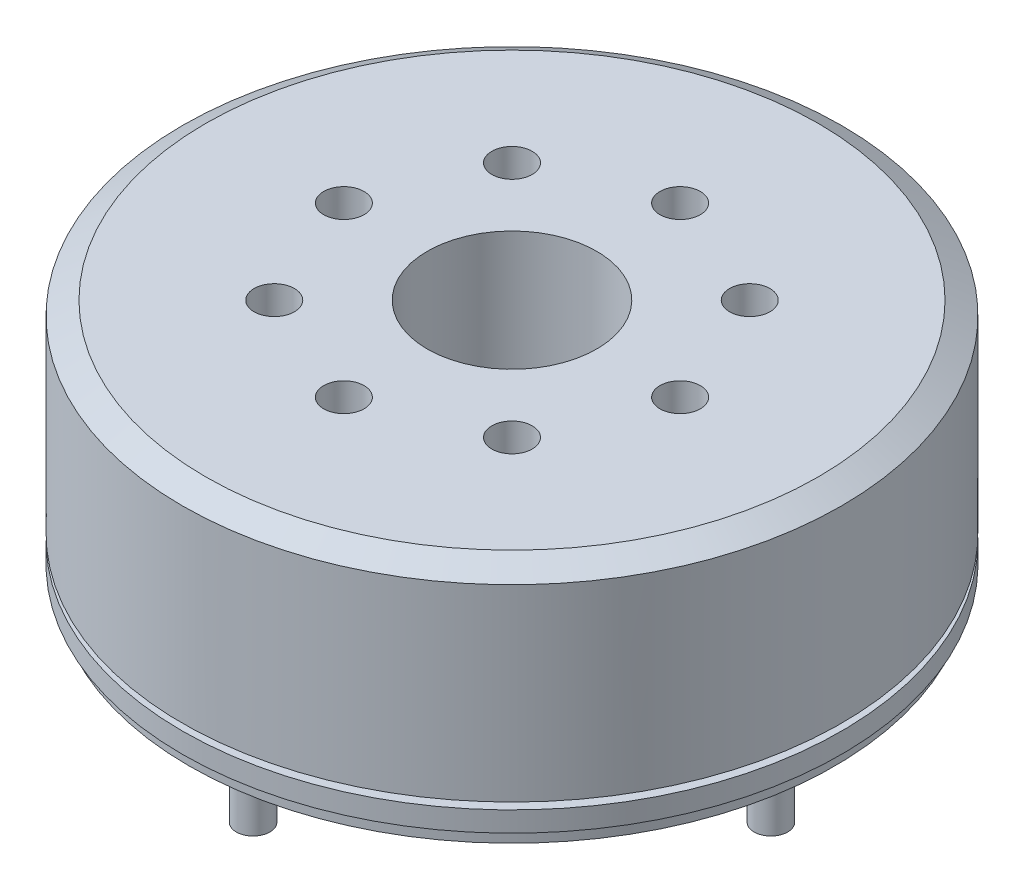
ISO-10303-21;
HEADER;
FILE_DESCRIPTION(('STEP AP214'),'2;1');
FILE_NAME('part.step','',(''),(''),'','','');
FILE_SCHEMA(('AUTOMOTIVE_DESIGN { 1 0 10303 214 1 1 1 1 }'));
ENDSEC;
DATA;
#1=APPLICATION_CONTEXT('core data for automotive mechanical design processes');
#2=APPLICATION_PROTOCOL_DEFINITION('international standard','automotive_design',2000,#1);
#3=PRODUCT_CONTEXT('',#1,'mechanical');
#4=PRODUCT('Part','Part','',(#3));
#5=PRODUCT_RELATED_PRODUCT_CATEGORY('part','',(#4));
#6=PRODUCT_DEFINITION_FORMATION('','',#4);
#7=PRODUCT_DEFINITION_CONTEXT('part definition',#1,'design');
#8=PRODUCT_DEFINITION('design','',#6,#7);
#9=PRODUCT_DEFINITION_SHAPE('','',#8);
#10=(LENGTH_UNIT() NAMED_UNIT(*) SI_UNIT(.MILLI.,.METRE.));
#11=(NAMED_UNIT(*) PLANE_ANGLE_UNIT() SI_UNIT($,.RADIAN.));
#12=(NAMED_UNIT(*) SI_UNIT($,.STERADIAN.) SOLID_ANGLE_UNIT());
#13=UNCERTAINTY_MEASURE_WITH_UNIT(LENGTH_MEASURE(1.E-05),#10,'distance_accuracy_value','');
#14=(GEOMETRIC_REPRESENTATION_CONTEXT(3) GLOBAL_UNCERTAINTY_ASSIGNED_CONTEXT((#13)) GLOBAL_UNIT_ASSIGNED_CONTEXT((#10,
#11,#12)) REPRESENTATION_CONTEXT('',''));
#15=CARTESIAN_POINT('',(0.,0.,0.));
#16=DIRECTION('',(0.,0.,1.));
#17=DIRECTION('',(1.,0.,0.));
#18=AXIS2_PLACEMENT_3D('',#15,#16,#17);
#19=CARTESIAN_POINT('',(0.,17.,0.));
#20=DIRECTION('',(0.,-1.,0.));
#21=DIRECTION('',(0.,0.,-1.));
#22=AXIS2_PLACEMENT_3D('',#19,#20,#21);
#23=CYLINDRICAL_SURFACE('',#22,24.5);
#24=CARTESIAN_POINT('',(0.,16.,0.));
#25=DIRECTION('',(0.,1.,0.));
#26=DIRECTION('',(0.,0.,1.));
#27=AXIS2_PLACEMENT_3D('',#24,#25,#26);
#28=CIRCLE('',#27,24.5);
#29=CARTESIAN_POINT('',(0.,16.,24.5));
#30=VERTEX_POINT('',#29);
#31=EDGE_CURVE('E40',#30,#30,#28,.F.);
#32=ORIENTED_EDGE('',*,*,#31,.T.);
#33=EDGE_LOOP('',(#32));
#34=FACE_BOUND('',#33,.T.);
#35=CARTESIAN_POINT('',(0.,2.00398798470401,0.));
#36=DIRECTION('',(0.,-1.,0.));
#37=DIRECTION('',(0.,0.,-1.));
#38=AXIS2_PLACEMENT_3D('',#35,#36,#37);
#39=CIRCLE('',#38,24.5);
#40=CARTESIAN_POINT('',(0.,2.00398798470401,-24.5));
#41=VERTEX_POINT('',#40);
#42=EDGE_CURVE('E68',#41,#41,#39,.T.);
#43=ORIENTED_EDGE('',*,*,#42,.F.);
#44=EDGE_LOOP('',(#43));
#45=FACE_BOUND('',#44,.T.);
#46=ADVANCED_FACE('F35',(#34,#45),#23,.T.);
#47=CARTESIAN_POINT('',(0.,17.,0.));
#48=DIRECTION('',(0.,1.,0.));
#49=DIRECTION('',(0.,0.,1.));
#50=AXIS2_PLACEMENT_3D('',#47,#48,#49);
#51=PLANE('',#50);
#52=CARTESIAN_POINT('',(-12.5,17.,0.));
#53=DIRECTION('',(0.,1.,0.));
#54=DIRECTION('',(1.,0.,0.));
#55=AXIS2_PLACEMENT_3D('',#52,#53,#54);
#56=CIRCLE('',#55,1.5);
#57=CARTESIAN_POINT('',(-11.,17.,0.));
#58=VERTEX_POINT('',#57);
#59=EDGE_CURVE('E399',#58,#58,#56,.T.);
#60=ORIENTED_EDGE('',*,*,#59,.F.);
#61=EDGE_LOOP('',(#60));
#62=FACE_BOUND('',#61,.T.);
#63=CARTESIAN_POINT('',(-8.8388347648318,17.,8.83883476483189));
#64=DIRECTION('',(0.,1.,0.));
#65=DIRECTION('',(0.707106781186544,0.,-0.707106781186551));
#66=AXIS2_PLACEMENT_3D('',#63,#64,#65);
#67=CIRCLE('',#66,1.5);
#68=CARTESIAN_POINT('',(-7.77817459305198,17.,7.77817459305206));
#69=VERTEX_POINT('',#68);
#70=EDGE_CURVE('E405',#69,#69,#67,.T.);
#71=ORIENTED_EDGE('',*,*,#70,.F.);
#72=EDGE_LOOP('',(#71));
#73=FACE_BOUND('',#72,.T.);
#74=CARTESIAN_POINT('',(0.,17.,12.5));
#75=DIRECTION('',(0.,1.,0.));
#76=DIRECTION('',(0.,0.,-1.));
#77=AXIS2_PLACEMENT_3D('',#74,#75,#76);
#78=CIRCLE('',#77,1.5);
#79=CARTESIAN_POINT('',(0.,17.,11.));
#80=VERTEX_POINT('',#79);
#81=EDGE_CURVE('E411',#80,#80,#78,.T.);
#82=ORIENTED_EDGE('',*,*,#81,.F.);
#83=EDGE_LOOP('',(#82));
#84=FACE_BOUND('',#83,.T.);
#85=CARTESIAN_POINT('',(8.83883476483192,17.,8.83883476483177));
#86=DIRECTION('',(0.,1.,0.));
#87=DIRECTION('',(-0.707106781186554,0.,-0.707106781186541));
#88=AXIS2_PLACEMENT_3D('',#85,#86,#87);
#89=CIRCLE('',#88,1.5);
#90=CARTESIAN_POINT('',(7.77817459305209,17.,7.77817459305196));
#91=VERTEX_POINT('',#90);
#92=EDGE_CURVE('E386',#91,#91,#89,.T.);
#93=ORIENTED_EDGE('',*,*,#92,.F.);
#94=EDGE_LOOP('',(#93));
#95=FACE_BOUND('',#94,.T.);
#96=CARTESIAN_POINT('',(12.5,17.,-1.30930550206618E-13));
#97=DIRECTION('',(0.,1.,0.));
#98=DIRECTION('',(-1.,0.,0.));
#99=AXIS2_PLACEMENT_3D('',#96,#97,#98);
#100=CIRCLE('',#99,1.5);
#101=CARTESIAN_POINT('',(11.,17.,-1.15218884181823E-13));
#102=VERTEX_POINT('',#101);
#103=EDGE_CURVE('E387',#102,#102,#100,.T.);
#104=ORIENTED_EDGE('',*,*,#103,.F.);
#105=EDGE_LOOP('',(#104));
#106=FACE_BOUND('',#105,.T.);
#107=CARTESIAN_POINT('',(8.83883476483174,17.,-8.83883476483195));
#108=DIRECTION('',(0.,1.,0.));
#109=DIRECTION('',(-0.707106781186539,0.,0.707106781186556));
#110=AXIS2_PLACEMENT_3D('',#107,#108,#109);
#111=CIRCLE('',#110,1.5);
#112=CARTESIAN_POINT('',(7.77817459305193,17.,-7.77817459305212));
#113=VERTEX_POINT('',#112);
#114=EDGE_CURVE('E380',#113,#113,#111,.T.);
#115=ORIENTED_EDGE('',*,*,#114,.F.);
#116=EDGE_LOOP('',(#115));
#117=FACE_BOUND('',#116,.T.);
#118=CARTESIAN_POINT('',(-8.83883476483186,17.,-8.83883476483183));
#119=DIRECTION('',(0.,1.,0.));
#120=DIRECTION('',(0.707106781186549,0.,0.707106781186546));
#121=AXIS2_PLACEMENT_3D('',#118,#119,#120);
#122=CIRCLE('',#121,1.5);
#123=CARTESIAN_POINT('',(-7.77817459305204,17.,-7.77817459305201));
#124=VERTEX_POINT('',#123);
#125=EDGE_CURVE('E398',#124,#124,#122,.T.);
#126=ORIENTED_EDGE('',*,*,#125,.F.);
#127=EDGE_LOOP('',(#126));
#128=FACE_BOUND('',#127,.T.);
#129=CARTESIAN_POINT('',(0.,17.,-12.5));
#130=DIRECTION('',(0.,1.,0.));
#131=DIRECTION('',(0.,0.,1.));
#132=AXIS2_PLACEMENT_3D('',#129,#130,#131);
#133=CIRCLE('',#132,1.5);
#134=CARTESIAN_POINT('',(0.,17.,-11.));
#135=VERTEX_POINT('',#134);
#136=EDGE_CURVE('E422',#135,#135,#133,.T.);
#137=ORIENTED_EDGE('',*,*,#136,.F.);
#138=EDGE_LOOP('',(#137));
#139=FACE_BOUND('',#138,.T.);
#140=CARTESIAN_POINT('',(0.,17.,0.));
#141=DIRECTION('',(0.,1.,0.));
#142=DIRECTION('',(0.,0.,1.));
#143=AXIS2_PLACEMENT_3D('',#140,#141,#142);
#144=CIRCLE('',#143,6.3);
#145=CARTESIAN_POINT('',(0.,17.,6.3));
#146=VERTEX_POINT('',#145);
#147=EDGE_CURVE('E440',#146,#146,#144,.T.);
#148=ORIENTED_EDGE('',*,*,#147,.F.);
#149=EDGE_LOOP('',(#148));
#150=FACE_BOUND('',#149,.T.);
#151=CARTESIAN_POINT('',(0.,17.,0.));
#152=DIRECTION('',(0.,1.,0.));
#153=DIRECTION('',(0.,0.,1.));
#154=AXIS2_PLACEMENT_3D('',#151,#152,#153);
#155=CIRCLE('',#154,22.7679491924311);
#156=CARTESIAN_POINT('',(0.,17.,22.7679491924311));
#157=VERTEX_POINT('',#156);
#158=EDGE_CURVE('E67',#157,#157,#155,.T.);
#159=ORIENTED_EDGE('',*,*,#158,.T.);
#160=EDGE_LOOP('',(#159));
#161=FACE_BOUND('',#160,.T.);
#162=ADVANCED_FACE('F94',(#62,#73,#84,#95,#106,#117,#128,#139,#150,#161),#51,.T.);
#163=CARTESIAN_POINT('',(0.,2.00398798470401,23.5));
#164=DIRECTION('',(0.,-1.,0.));
#165=DIRECTION('',(0.,0.,-1.));
#166=AXIS2_PLACEMENT_3D('',#163,#164,#165);
#167=PLANE('',#166);
#168=CARTESIAN_POINT('',(0.,2.00398798470401,0.));
#169=DIRECTION('',(0.,-1.,0.));
#170=DIRECTION('',(0.,0.,-1.));
#171=AXIS2_PLACEMENT_3D('',#168,#169,#170);
#172=CIRCLE('',#171,23.5);
#173=CARTESIAN_POINT('',(0.,2.00398798470401,-23.5));
#174=VERTEX_POINT('',#173);
#175=EDGE_CURVE('E56',#174,#174,#172,.T.);
#176=ORIENTED_EDGE('',*,*,#175,.F.);
#177=EDGE_LOOP('',(#176));
#178=FACE_BOUND('',#177,.T.);
#179=ORIENTED_EDGE('',*,*,#42,.T.);
#180=EDGE_LOOP('',(#179));
#181=FACE_BOUND('',#180,.T.);
#182=ADVANCED_FACE('F98',(#178,#181),#167,.T.);
#183=CARTESIAN_POINT('',(0.,1.5,25.8374556553472));
#184=DIRECTION('',(0.,1.,0.));
#185=DIRECTION('',(0.,0.,1.));
#186=AXIS2_PLACEMENT_3D('',#183,#184,#185);
#187=PLANE('',#186);
#188=CARTESIAN_POINT('',(0.,1.5,0.));
#189=DIRECTION('',(0.,-1.,0.));
#190=DIRECTION('',(0.,0.,-1.));
#191=AXIS2_PLACEMENT_3D('',#188,#189,#190);
#192=CIRCLE('',#191,23.5);
#193=CARTESIAN_POINT('',(0.,1.5,-23.5));
#194=VERTEX_POINT('',#193);
#195=EDGE_CURVE('E60',#194,#194,#192,.T.);
#196=ORIENTED_EDGE('',*,*,#195,.T.);
#197=EDGE_LOOP('',(#196));
#198=FACE_BOUND('',#197,.T.);
#199=CARTESIAN_POINT('',(0.,1.5,0.));
#200=DIRECTION('',(0.,1.,0.));
#201=DIRECTION('',(0.,0.,1.));
#202=AXIS2_PLACEMENT_3D('',#199,#200,#201);
#203=CIRCLE('',#202,24.5);
#204=CARTESIAN_POINT('',(0.,1.5,24.5));
#205=VERTEX_POINT('',#204);
#206=EDGE_CURVE('E63',#205,#205,#203,.T.);
#207=ORIENTED_EDGE('',*,*,#206,.T.);
#208=EDGE_LOOP('',(#207));
#209=FACE_BOUND('',#208,.T.);
#210=ADVANCED_FACE('F108',(#198,#209),#187,.T.);
#211=CARTESIAN_POINT('',(0.,0.,0.));
#212=DIRECTION('',(0.,-1.,0.));
#213=DIRECTION('',(0.,0.,-1.));
#214=AXIS2_PLACEMENT_3D('',#211,#212,#213);
#215=CYLINDRICAL_SURFACE('',#214,23.5);
#216=ORIENTED_EDGE('',*,*,#175,.T.);
#217=EDGE_LOOP('',(#216));
#218=FACE_BOUND('',#217,.T.);
#219=ORIENTED_EDGE('',*,*,#195,.F.);
#220=EDGE_LOOP('',(#219));
#221=FACE_BOUND('',#220,.T.);
#222=ADVANCED_FACE('F103',(#218,#221),#215,.T.);
#223=CARTESIAN_POINT('',(0.,0.,0.));
#224=DIRECTION('',(0.,1.,0.));
#225=DIRECTION('',(0.,0.,1.));
#226=AXIS2_PLACEMENT_3D('',#223,#224,#225);
#227=PLANE('',#226);
#228=CARTESIAN_POINT('',(0.,0.,0.));
#229=DIRECTION('',(0.,-1.,0.));
#230=DIRECTION('',(0.,0.,-1.));
#231=AXIS2_PLACEMENT_3D('',#228,#229,#230);
#232=CIRCLE('',#231,24.);
#233=CARTESIAN_POINT('',(0.,0.,-24.));
#234=VERTEX_POINT('',#233);
#235=EDGE_CURVE('E44',#234,#234,#232,.T.);
#236=ORIENTED_EDGE('',*,*,#235,.F.);
#237=EDGE_LOOP('',(#236));
#238=FACE_BOUND('',#237,.T.);
#239=CARTESIAN_POINT('',(0.,0.,0.));
#240=DIRECTION('',(0.,1.,0.));
#241=DIRECTION('',(0.,0.,1.));
#242=AXIS2_PLACEMENT_3D('',#239,#240,#241);
#243=CIRCLE('',#242,24.5);
#244=CARTESIAN_POINT('',(0.,0.,24.5));
#245=VERTEX_POINT('',#244);
#246=EDGE_CURVE('E64',#245,#245,#243,.T.);
#247=ORIENTED_EDGE('',*,*,#246,.F.);
#248=EDGE_LOOP('',(#247));
#249=FACE_BOUND('',#248,.T.);
#250=ADVANCED_FACE('F91',(#238,#249),#227,.F.);
#251=ORIENTED_EDGE('',*,*,#246,.T.);
#252=EDGE_LOOP('',(#251));
#253=FACE_BOUND('',#252,.T.);
#254=ORIENTED_EDGE('',*,*,#206,.F.);
#255=EDGE_LOOP('',(#254));
#256=FACE_BOUND('',#255,.T.);
#257=ADVANCED_FACE('F83',(#253,#256),#23,.T.);
#258=CARTESIAN_POINT('',(0.,17.,0.));
#259=DIRECTION('',(0.,-1.,0.));
#260=DIRECTION('',(0.,0.,-1.));
#261=AXIS2_PLACEMENT_3D('',#258,#259,#260);
#262=CONICAL_SURFACE('',#261,22.7679491924311,1.04719755119659);
#263=ORIENTED_EDGE('',*,*,#31,.F.);
#264=EDGE_LOOP('',(#263));
#265=FACE_BOUND('',#264,.T.);
#266=ORIENTED_EDGE('',*,*,#158,.F.);
#267=EDGE_LOOP('',(#266));
#268=FACE_BOUND('',#267,.T.);
#269=ADVANCED_FACE('F38',(#265,#268),#262,.T.);
#270=CARTESIAN_POINT('',(0.,-1.,0.));
#271=DIRECTION('',(0.,1.,0.));
#272=DIRECTION('',(0.,0.,1.));
#273=AXIS2_PLACEMENT_3D('',#270,#271,#272);
#274=CYLINDRICAL_SURFACE('',#273,24.);
#275=CARTESIAN_POINT('',(0.,-1.,0.));
#276=DIRECTION('',(0.,-1.,0.));
#277=DIRECTION('',(0.,0.,-1.));
#278=AXIS2_PLACEMENT_3D('',#275,#276,#277);
#279=CIRCLE('',#278,24.);
#280=CARTESIAN_POINT('',(0.,-1.,-24.));
#281=VERTEX_POINT('',#280);
#282=EDGE_CURVE('E54',#281,#281,#279,.T.);
#283=ORIENTED_EDGE('',*,*,#282,.F.);
#284=EDGE_LOOP('',(#283));
#285=FACE_BOUND('',#284,.T.);
#286=ORIENTED_EDGE('',*,*,#235,.T.);
#287=EDGE_LOOP('',(#286));
#288=FACE_BOUND('',#287,.T.);
#289=ADVANCED_FACE('F82',(#285,#288),#274,.T.);
#290=CARTESIAN_POINT('',(0.,-1.,0.));
#291=DIRECTION('',(0.,-1.,0.));
#292=DIRECTION('',(0.,0.,-1.));
#293=AXIS2_PLACEMENT_3D('',#290,#291,#292);
#294=PLANE('',#293);
#295=CARTESIAN_POINT('',(19.25,-1.,2.01633047318191E-13));
#296=DIRECTION('',(0.,-1.,0.));
#297=DIRECTION('',(-1.,0.,0.));
#298=AXIS2_PLACEMENT_3D('',#295,#296,#297);
#299=CIRCLE('',#298,1.25);
#300=CARTESIAN_POINT('',(18.,-1.,1.88539992297529E-13));
#301=VERTEX_POINT('',#300);
#302=EDGE_CURVE('E312',#301,#301,#299,.T.);
#303=ORIENTED_EDGE('',*,*,#302,.F.);
#304=EDGE_LOOP('',(#303));
#305=FACE_BOUND('',#304,.T.);
#306=CARTESIAN_POINT('',(0.,-1.,-19.25));
#307=DIRECTION('',(0.,-1.,0.));
#308=DIRECTION('',(0.,0.,1.));
#309=AXIS2_PLACEMENT_3D('',#306,#307,#308);
#310=CIRCLE('',#309,1.25);
#311=CARTESIAN_POINT('',(0.,-1.,-18.));
#312=VERTEX_POINT('',#311);
#313=EDGE_CURVE('E311',#312,#312,#310,.T.);
#314=ORIENTED_EDGE('',*,*,#313,.F.);
#315=EDGE_LOOP('',(#314));
#316=FACE_BOUND('',#315,.T.);
#317=CARTESIAN_POINT('',(-19.25,-1.,0.));
#318=DIRECTION('',(0.,-1.,0.));
#319=DIRECTION('',(1.,0.,0.));
#320=AXIS2_PLACEMENT_3D('',#317,#318,#319);
#321=CIRCLE('',#320,1.25);
#322=CARTESIAN_POINT('',(-18.,-1.,0.));
#323=VERTEX_POINT('',#322);
#324=EDGE_CURVE('E321',#323,#323,#321,.T.);
#325=ORIENTED_EDGE('',*,*,#324,.F.);
#326=EDGE_LOOP('',(#325));
#327=FACE_BOUND('',#326,.T.);
#328=CARTESIAN_POINT('',(0.,-1.,19.25));
#329=DIRECTION('',(0.,-1.,0.));
#330=DIRECTION('',(0.,0.,-1.));
#331=AXIS2_PLACEMENT_3D('',#328,#329,#330);
#332=CIRCLE('',#331,1.25);
#333=CARTESIAN_POINT('',(0.,-1.,18.));
#334=VERTEX_POINT('',#333);
#335=EDGE_CURVE('E326',#334,#334,#332,.T.);
#336=ORIENTED_EDGE('',*,*,#335,.F.);
#337=EDGE_LOOP('',(#336));
#338=FACE_BOUND('',#337,.T.);
#339=CARTESIAN_POINT('',(-15.,-1.,0.));
#340=DIRECTION('',(0.,-1.,0.));
#341=DIRECTION('',(1.,0.,0.));
#342=AXIS2_PLACEMENT_3D('',#339,#340,#341);
#343=CIRCLE('',#342,1.5);
#344=CARTESIAN_POINT('',(-13.5,-1.,0.));
#345=VERTEX_POINT('',#344);
#346=EDGE_CURVE('E363',#345,#345,#343,.T.);
#347=ORIENTED_EDGE('',*,*,#346,.F.);
#348=EDGE_LOOP('',(#347));
#349=FACE_BOUND('',#348,.T.);
#350=CARTESIAN_POINT('',(0.,-1.,-15.));
#351=DIRECTION('',(0.,-1.,0.));
#352=DIRECTION('',(0.,0.,1.));
#353=AXIS2_PLACEMENT_3D('',#350,#351,#352);
#354=CIRCLE('',#353,1.5);
#355=CARTESIAN_POINT('',(0.,-1.,-13.5));
#356=VERTEX_POINT('',#355);
#357=EDGE_CURVE('E369',#356,#356,#354,.T.);
#358=ORIENTED_EDGE('',*,*,#357,.F.);
#359=EDGE_LOOP('',(#358));
#360=FACE_BOUND('',#359,.T.);
#361=CARTESIAN_POINT('',(15.,-1.,1.57116660247941E-13));
#362=DIRECTION('',(0.,-1.,0.));
#363=DIRECTION('',(-1.,0.,0.));
#364=AXIS2_PLACEMENT_3D('',#361,#362,#363);
#365=CIRCLE('',#364,1.5);
#366=CARTESIAN_POINT('',(13.5,-1.,1.41404994223147E-13));
#367=VERTEX_POINT('',#366);
#368=EDGE_CURVE('E356',#367,#367,#365,.T.);
#369=ORIENTED_EDGE('',*,*,#368,.F.);
#370=EDGE_LOOP('',(#369));
#371=FACE_BOUND('',#370,.T.);
#372=CARTESIAN_POINT('',(0.,-1.,15.));
#373=DIRECTION('',(0.,-1.,0.));
#374=DIRECTION('',(0.,0.,-1.));
#375=AXIS2_PLACEMENT_3D('',#372,#373,#374);
#376=CIRCLE('',#375,1.5);
#377=CARTESIAN_POINT('',(0.,-1.,13.5));
#378=VERTEX_POINT('',#377);
#379=EDGE_CURVE('E362',#378,#378,#376,.T.);
#380=ORIENTED_EDGE('',*,*,#379,.F.);
#381=EDGE_LOOP('',(#380));
#382=FACE_BOUND('',#381,.T.);
#383=CARTESIAN_POINT('',(0.,-1.,0.));
#384=DIRECTION('',(0.,-1.,0.));
#385=DIRECTION('',(0.,0.,-1.));
#386=AXIS2_PLACEMENT_3D('',#383,#384,#385);
#387=CIRCLE('',#386,8.3);
#388=CARTESIAN_POINT('',(0.,-1.,-8.3));
#389=VERTEX_POINT('',#388);
#390=EDGE_CURVE('E10',#389,#389,#387,.T.);
#391=ORIENTED_EDGE('',*,*,#390,.F.);
#392=EDGE_LOOP('',(#391));
#393=FACE_BOUND('',#392,.T.);
#394=ORIENTED_EDGE('',*,*,#282,.T.);
#395=EDGE_LOOP('',(#394));
#396=FACE_BOUND('',#395,.T.);
#397=ADVANCED_FACE('F88',(#305,#316,#327,#338,#349,#360,#371,#382,#393,#396),#294,.T.);
#398=CARTESIAN_POINT('',(0.,-2.,0.));
#399=DIRECTION('',(0.,1.,0.));
#400=DIRECTION('',(0.,0.,1.));
#401=AXIS2_PLACEMENT_3D('',#398,#399,#400);
#402=CYLINDRICAL_SURFACE('',#401,8.3);
#403=CARTESIAN_POINT('',(0.,-2.,0.));
#404=DIRECTION('',(0.,-1.,0.));
#405=DIRECTION('',(0.,0.,-1.));
#406=AXIS2_PLACEMENT_3D('',#403,#404,#405);
#407=CIRCLE('',#406,8.3);
#408=CARTESIAN_POINT('',(0.,-2.,-8.3));
#409=VERTEX_POINT('',#408);
#410=EDGE_CURVE('E52',#409,#409,#407,.T.);
#411=ORIENTED_EDGE('',*,*,#410,.F.);
#412=EDGE_LOOP('',(#411));
#413=FACE_BOUND('',#412,.T.);
#414=ORIENTED_EDGE('',*,*,#390,.T.);
#415=EDGE_LOOP('',(#414));
#416=FACE_BOUND('',#415,.T.);
#417=ADVANCED_FACE('F118',(#413,#416),#402,.T.);
#418=CARTESIAN_POINT('',(0.,-2.,0.));
#419=DIRECTION('',(0.,-1.,0.));
#420=DIRECTION('',(0.,0.,-1.));
#421=AXIS2_PLACEMENT_3D('',#418,#419,#420);
#422=PLANE('',#421);
#423=CARTESIAN_POINT('',(5.1724854039699,-2.,0.));
#424=DIRECTION('',(0.,-1.,0.));
#425=DIRECTION('',(-1.,0.,0.));
#426=AXIS2_PLACEMENT_3D('',#423,#424,#425);
#427=CIRCLE('',#426,1.25);
#428=CARTESIAN_POINT('',(3.9224854039699,-2.,0.));
#429=VERTEX_POINT('',#428);
#430=EDGE_CURVE('E339',#429,#429,#427,.T.);
#431=ORIENTED_EDGE('',*,*,#430,.F.);
#432=EDGE_LOOP('',(#431));
#433=FACE_BOUND('',#432,.T.);
#434=CARTESIAN_POINT('',(0.,-2.,-5.1724854039699));
#435=DIRECTION('',(0.,-1.,0.));
#436=DIRECTION('',(0.,0.,1.));
#437=AXIS2_PLACEMENT_3D('',#434,#435,#436);
#438=CIRCLE('',#437,1.25);
#439=CARTESIAN_POINT('',(0.,-2.,-3.9224854039699));
#440=VERTEX_POINT('',#439);
#441=EDGE_CURVE('E345',#440,#440,#438,.T.);
#442=ORIENTED_EDGE('',*,*,#441,.F.);
#443=EDGE_LOOP('',(#442));
#444=FACE_BOUND('',#443,.T.);
#445=CARTESIAN_POINT('',(-5.1724854039699,-2.,0.));
#446=DIRECTION('',(0.,-1.,0.));
#447=DIRECTION('',(1.,0.,0.));
#448=AXIS2_PLACEMENT_3D('',#445,#446,#447);
#449=CIRCLE('',#448,1.25);
#450=CARTESIAN_POINT('',(-3.9224854039699,-2.,0.));
#451=VERTEX_POINT('',#450);
#452=EDGE_CURVE('E332',#451,#451,#449,.T.);
#453=ORIENTED_EDGE('',*,*,#452,.F.);
#454=EDGE_LOOP('',(#453));
#455=FACE_BOUND('',#454,.T.);
#456=CARTESIAN_POINT('',(0.,-2.,5.1724854039699));
#457=DIRECTION('',(0.,-1.,0.));
#458=DIRECTION('',(0.,0.,-1.));
#459=AXIS2_PLACEMENT_3D('',#456,#457,#458);
#460=CIRCLE('',#459,1.25);
#461=CARTESIAN_POINT('',(0.,-2.,3.9224854039699));
#462=VERTEX_POINT('',#461);
#463=EDGE_CURVE('E338',#462,#462,#460,.T.);
#464=ORIENTED_EDGE('',*,*,#463,.F.);
#465=EDGE_LOOP('',(#464));
#466=FACE_BOUND('',#465,.T.);
#467=CARTESIAN_POINT('',(0.,-2.,0.));
#468=DIRECTION('',(0.,-1.,0.));
#469=DIRECTION('',(0.,0.,-1.));
#470=AXIS2_PLACEMENT_3D('',#467,#468,#469);
#471=CIRCLE('',#470,2.5);
#472=CARTESIAN_POINT('',(0.,-2.,-2.5));
#473=VERTEX_POINT('',#472);
#474=EDGE_CURVE('E433',#473,#473,#471,.F.);
#475=ORIENTED_EDGE('',*,*,#474,.T.);
#476=EDGE_LOOP('',(#475));
#477=FACE_BOUND('',#476,.T.);
#478=ORIENTED_EDGE('',*,*,#410,.T.);
#479=EDGE_LOOP('',(#478));
#480=FACE_BOUND('',#479,.T.);
#481=ADVANCED_FACE('F122',(#433,#444,#455,#466,#477,#480),#422,.T.);
#482=CARTESIAN_POINT('',(0.,3.,0.));
#483=DIRECTION('',(0.,1.,0.));
#484=DIRECTION('',(0.,0.,1.));
#485=AXIS2_PLACEMENT_3D('',#482,#483,#484);
#486=CYLINDRICAL_SURFACE('',#485,6.3);
#487=CARTESIAN_POINT('',(0.,3.,0.));
#488=DIRECTION('',(0.,1.,0.));
#489=DIRECTION('',(0.,0.,1.));
#490=AXIS2_PLACEMENT_3D('',#487,#488,#489);
#491=CIRCLE('',#490,6.3);
#492=CARTESIAN_POINT('',(0.,3.,6.3));
#493=VERTEX_POINT('',#492);
#494=EDGE_CURVE('E443',#493,#493,#491,.T.);
#495=ORIENTED_EDGE('',*,*,#494,.F.);
#496=EDGE_LOOP('',(#495));
#497=FACE_BOUND('',#496,.T.);
#498=ORIENTED_EDGE('',*,*,#147,.T.);
#499=EDGE_LOOP('',(#498));
#500=FACE_BOUND('',#499,.T.);
#501=ADVANCED_FACE('F126',(#497,#500),#486,.F.);
#502=CARTESIAN_POINT('',(0.,3.,0.));
#503=DIRECTION('',(0.,1.,0.));
#504=DIRECTION('',(0.,0.,1.));
#505=AXIS2_PLACEMENT_3D('',#502,#503,#504);
#506=PLANE('',#505);
#507=CARTESIAN_POINT('',(0.,3.,0.));
#508=DIRECTION('',(0.,1.,0.));
#509=DIRECTION('',(0.,0.,1.));
#510=AXIS2_PLACEMENT_3D('',#507,#508,#509);
#511=CIRCLE('',#510,4.);
#512=CARTESIAN_POINT('',(0.,3.,4.));
#513=VERTEX_POINT('',#512);
#514=EDGE_CURVE('E436',#513,#513,#511,.T.);
#515=ORIENTED_EDGE('',*,*,#514,.F.);
#516=EDGE_LOOP('',(#515));
#517=FACE_BOUND('',#516,.T.);
#518=ORIENTED_EDGE('',*,*,#494,.T.);
#519=EDGE_LOOP('',(#518));
#520=FACE_BOUND('',#519,.T.);
#521=ADVANCED_FACE('F130',(#517,#520),#506,.T.);
#522=CARTESIAN_POINT('',(0.,0.,0.));
#523=DIRECTION('',(0.,1.,0.));
#524=DIRECTION('',(0.,0.,1.));
#525=AXIS2_PLACEMENT_3D('',#522,#523,#524);
#526=CYLINDRICAL_SURFACE('',#525,4.);
#527=CARTESIAN_POINT('',(0.,0.,0.));
#528=DIRECTION('',(0.,1.,0.));
#529=DIRECTION('',(0.,0.,1.));
#530=AXIS2_PLACEMENT_3D('',#527,#528,#529);
#531=CIRCLE('',#530,4.);
#532=CARTESIAN_POINT('',(0.,0.,4.));
#533=VERTEX_POINT('',#532);
#534=EDGE_CURVE('E437',#533,#533,#531,.T.);
#535=ORIENTED_EDGE('',*,*,#534,.F.);
#536=EDGE_LOOP('',(#535));
#537=FACE_BOUND('',#536,.T.);
#538=ORIENTED_EDGE('',*,*,#514,.T.);
#539=EDGE_LOOP('',(#538));
#540=FACE_BOUND('',#539,.T.);
#541=ADVANCED_FACE('F134',(#537,#540),#526,.F.);
#542=CARTESIAN_POINT('',(0.,0.,0.));
#543=DIRECTION('',(0.,1.,0.));
#544=DIRECTION('',(0.,0.,1.));
#545=AXIS2_PLACEMENT_3D('',#542,#543,#544);
#546=PLANE('',#545);
#547=CARTESIAN_POINT('',(0.,0.,0.));
#548=DIRECTION('',(0.,1.,0.));
#549=DIRECTION('',(0.,0.,1.));
#550=AXIS2_PLACEMENT_3D('',#547,#548,#549);
#551=CIRCLE('',#550,2.5);
#552=CARTESIAN_POINT('',(0.,0.,2.5));
#553=VERTEX_POINT('',#552);
#554=EDGE_CURVE('E428',#553,#553,#551,.T.);
#555=ORIENTED_EDGE('',*,*,#554,.F.);
#556=EDGE_LOOP('',(#555));
#557=FACE_BOUND('',#556,.T.);
#558=ORIENTED_EDGE('',*,*,#534,.T.);
#559=EDGE_LOOP('',(#558));
#560=FACE_BOUND('',#559,.T.);
#561=ADVANCED_FACE('F138',(#557,#560),#546,.T.);
#562=CARTESIAN_POINT('',(0.,-9.07106781186547,0.));
#563=DIRECTION('',(0.,1.,0.));
#564=DIRECTION('',(0.,0.,1.));
#565=AXIS2_PLACEMENT_3D('',#562,#563,#564);
#566=CYLINDRICAL_SURFACE('',#565,2.5);
#567=ORIENTED_EDGE('',*,*,#554,.T.);
#568=EDGE_LOOP('',(#567));
#569=FACE_BOUND('',#568,.T.);
#570=ORIENTED_EDGE('',*,*,#474,.F.);
#571=EDGE_LOOP('',(#570));
#572=FACE_BOUND('',#571,.T.);
#573=ADVANCED_FACE('F142',(#569,#572),#566,.F.);
#574=CARTESIAN_POINT('',(0.,14.,-12.5));
#575=DIRECTION('',(0.,1.,0.));
#576=DIRECTION('',(0.,0.,1.));
#577=AXIS2_PLACEMENT_3D('',#574,#575,#576);
#578=CYLINDRICAL_SURFACE('',#577,1.5);
#579=CARTESIAN_POINT('',(0.,14.,-12.5));
#580=DIRECTION('',(0.,1.,0.));
#581=DIRECTION('',(0.,0.,1.));
#582=AXIS2_PLACEMENT_3D('',#579,#580,#581);
#583=CIRCLE('',#582,1.5);
#584=CARTESIAN_POINT('',(0.,14.,-11.));
#585=VERTEX_POINT('',#584);
#586=EDGE_CURVE('E425',#585,#585,#583,.T.);
#587=ORIENTED_EDGE('',*,*,#586,.F.);
#588=EDGE_LOOP('',(#587));
#589=FACE_BOUND('',#588,.T.);
#590=ORIENTED_EDGE('',*,*,#136,.T.);
#591=EDGE_LOOP('',(#590));
#592=FACE_BOUND('',#591,.T.);
#593=ADVANCED_FACE('F146',(#589,#592),#578,.F.);
#594=CARTESIAN_POINT('',(0.,14.,-12.5));
#595=DIRECTION('',(0.,1.,0.));
#596=DIRECTION('',(0.,0.,1.));
#597=AXIS2_PLACEMENT_3D('',#594,#595,#596);
#598=PLANE('',#597);
#599=ORIENTED_EDGE('',*,*,#586,.T.);
#600=EDGE_LOOP('',(#599));
#601=FACE_BOUND('',#600,.T.);
#602=ADVANCED_FACE('F150',(#601),#598,.T.);
#603=CARTESIAN_POINT('',(-8.83883476483186,14.,-8.83883476483183));
#604=DIRECTION('',(0.,1.,0.));
#605=DIRECTION('',(0.,0.,1.));
#606=AXIS2_PLACEMENT_3D('',#603,#604,#605);
#607=CYLINDRICAL_SURFACE('',#606,1.5);
#608=CARTESIAN_POINT('',(-8.83883476483186,14.,-8.83883476483183));
#609=DIRECTION('',(0.,1.,0.));
#610=DIRECTION('',(0.707106781186549,0.,0.707106781186546));
#611=AXIS2_PLACEMENT_3D('',#608,#609,#610);
#612=CIRCLE('',#611,1.5);
#613=CARTESIAN_POINT('',(-7.77817459305204,14.,-7.77817459305201));
#614=VERTEX_POINT('',#613);
#615=EDGE_CURVE('E419',#614,#614,#612,.T.);
#616=ORIENTED_EDGE('',*,*,#615,.F.);
#617=EDGE_LOOP('',(#616));
#618=FACE_BOUND('',#617,.T.);
#619=ORIENTED_EDGE('',*,*,#125,.T.);
#620=EDGE_LOOP('',(#619));
#621=FACE_BOUND('',#620,.T.);
#622=ADVANCED_FACE('F154',(#618,#621),#607,.F.);
#623=CARTESIAN_POINT('',(-8.83883476483186,14.,-8.83883476483183));
#624=DIRECTION('',(0.,1.,0.));
#625=DIRECTION('',(0.707106781186549,0.,0.707106781186546));
#626=AXIS2_PLACEMENT_3D('',#623,#624,#625);
#627=PLANE('',#626);
#628=ORIENTED_EDGE('',*,*,#615,.T.);
#629=EDGE_LOOP('',(#628));
#630=FACE_BOUND('',#629,.T.);
#631=ADVANCED_FACE('F158',(#630),#627,.T.);
#632=CARTESIAN_POINT('',(8.83883476483174,14.,-8.83883476483195));
#633=DIRECTION('',(0.,1.,0.));
#634=DIRECTION('',(0.,0.,1.));
#635=AXIS2_PLACEMENT_3D('',#632,#633,#634);
#636=CYLINDRICAL_SURFACE('',#635,1.5);
#637=CARTESIAN_POINT('',(8.83883476483174,14.,-8.83883476483195));
#638=DIRECTION('',(0.,1.,0.));
#639=DIRECTION('',(-0.707106781186539,0.,0.707106781186556));
#640=AXIS2_PLACEMENT_3D('',#637,#638,#639);
#641=CIRCLE('',#640,1.5);
#642=CARTESIAN_POINT('',(7.77817459305193,14.,-7.77817459305212));
#643=VERTEX_POINT('',#642);
#644=EDGE_CURVE('E390',#643,#643,#641,.T.);
#645=ORIENTED_EDGE('',*,*,#644,.F.);
#646=EDGE_LOOP('',(#645));
#647=FACE_BOUND('',#646,.T.);
#648=ORIENTED_EDGE('',*,*,#114,.T.);
#649=EDGE_LOOP('',(#648));
#650=FACE_BOUND('',#649,.T.);
#651=ADVANCED_FACE('F162',(#647,#650),#636,.F.);
#652=CARTESIAN_POINT('',(8.83883476483174,14.,-8.83883476483195));
#653=DIRECTION('',(0.,1.,0.));
#654=DIRECTION('',(-0.707106781186539,0.,0.707106781186556));
#655=AXIS2_PLACEMENT_3D('',#652,#653,#654);
#656=PLANE('',#655);
#657=ORIENTED_EDGE('',*,*,#644,.T.);
#658=EDGE_LOOP('',(#657));
#659=FACE_BOUND('',#658,.T.);
#660=ADVANCED_FACE('F200',(#659),#656,.T.);
#661=CARTESIAN_POINT('',(12.5,14.,-1.30930550206618E-13));
#662=DIRECTION('',(0.,1.,0.));
#663=DIRECTION('',(0.,0.,1.));
#664=AXIS2_PLACEMENT_3D('',#661,#662,#663);
#665=CYLINDRICAL_SURFACE('',#664,1.5);
#666=CARTESIAN_POINT('',(12.5,14.,-1.30930550206618E-13));
#667=DIRECTION('',(0.,1.,0.));
#668=DIRECTION('',(-1.,0.,0.));
#669=AXIS2_PLACEMENT_3D('',#666,#667,#668);
#670=CIRCLE('',#669,1.5);
#671=CARTESIAN_POINT('',(11.,14.,-1.15218884181823E-13));
#672=VERTEX_POINT('',#671);
#673=EDGE_CURVE('E383',#672,#672,#670,.T.);
#674=ORIENTED_EDGE('',*,*,#673,.F.);
#675=EDGE_LOOP('',(#674));
#676=FACE_BOUND('',#675,.T.);
#677=ORIENTED_EDGE('',*,*,#103,.T.);
#678=EDGE_LOOP('',(#677));
#679=FACE_BOUND('',#678,.T.);
#680=ADVANCED_FACE('F204',(#676,#679),#665,.F.);
#681=CARTESIAN_POINT('',(12.5,14.,-1.30930550206618E-13));
#682=DIRECTION('',(0.,1.,0.));
#683=DIRECTION('',(-1.,0.,0.));
#684=AXIS2_PLACEMENT_3D('',#681,#682,#683);
#685=PLANE('',#684);
#686=ORIENTED_EDGE('',*,*,#673,.T.);
#687=EDGE_LOOP('',(#686));
#688=FACE_BOUND('',#687,.T.);
#689=ADVANCED_FACE('F168',(#688),#685,.T.);
#690=CARTESIAN_POINT('',(8.83883476483192,14.,8.83883476483177));
#691=DIRECTION('',(0.,1.,0.));
#692=DIRECTION('',(0.,0.,1.));
#693=AXIS2_PLACEMENT_3D('',#690,#691,#692);
#694=CYLINDRICAL_SURFACE('',#693,1.5);
#695=CARTESIAN_POINT('',(8.83883476483192,14.,8.83883476483177));
#696=DIRECTION('',(0.,1.,0.));
#697=DIRECTION('',(-0.707106781186554,0.,-0.707106781186541));
#698=AXIS2_PLACEMENT_3D('',#695,#696,#697);
#699=CIRCLE('',#698,1.5);
#700=CARTESIAN_POINT('',(7.77817459305209,14.,7.77817459305196));
#701=VERTEX_POINT('',#700);
#702=EDGE_CURVE('E414',#701,#701,#699,.T.);
#703=ORIENTED_EDGE('',*,*,#702,.F.);
#704=EDGE_LOOP('',(#703));
#705=FACE_BOUND('',#704,.T.);
#706=ORIENTED_EDGE('',*,*,#92,.T.);
#707=EDGE_LOOP('',(#706));
#708=FACE_BOUND('',#707,.T.);
#709=ADVANCED_FACE('F164',(#705,#708),#694,.F.);
#710=CARTESIAN_POINT('',(8.83883476483192,14.,8.83883476483177));
#711=DIRECTION('',(0.,1.,0.));
#712=DIRECTION('',(-0.707106781186554,0.,-0.707106781186541));
#713=AXIS2_PLACEMENT_3D('',#710,#711,#712);
#714=PLANE('',#713);
#715=ORIENTED_EDGE('',*,*,#702,.T.);
#716=EDGE_LOOP('',(#715));
#717=FACE_BOUND('',#716,.T.);
#718=ADVANCED_FACE('F167',(#717),#714,.T.);
#719=CARTESIAN_POINT('',(0.,14.,12.5));
#720=DIRECTION('',(0.,1.,0.));
#721=DIRECTION('',(0.,0.,1.));
#722=AXIS2_PLACEMENT_3D('',#719,#720,#721);
#723=CYLINDRICAL_SURFACE('',#722,1.5);
#724=CARTESIAN_POINT('',(0.,14.,12.5));
#725=DIRECTION('',(0.,1.,0.));
#726=DIRECTION('',(0.,0.,-1.));
#727=AXIS2_PLACEMENT_3D('',#724,#725,#726);
#728=CIRCLE('',#727,1.5);
#729=CARTESIAN_POINT('',(0.,14.,11.));
#730=VERTEX_POINT('',#729);
#731=EDGE_CURVE('E408',#730,#730,#728,.T.);
#732=ORIENTED_EDGE('',*,*,#731,.F.);
#733=EDGE_LOOP('',(#732));
#734=FACE_BOUND('',#733,.T.);
#735=ORIENTED_EDGE('',*,*,#81,.T.);
#736=EDGE_LOOP('',(#735));
#737=FACE_BOUND('',#736,.T.);
#738=ADVANCED_FACE('F172',(#734,#737),#723,.F.);
#739=CARTESIAN_POINT('',(0.,14.,12.5));
#740=DIRECTION('',(0.,1.,0.));
#741=DIRECTION('',(0.,0.,-1.));
#742=AXIS2_PLACEMENT_3D('',#739,#740,#741);
#743=PLANE('',#742);
#744=ORIENTED_EDGE('',*,*,#731,.T.);
#745=EDGE_LOOP('',(#744));
#746=FACE_BOUND('',#745,.T.);
#747=ADVANCED_FACE('F176',(#746),#743,.T.);
#748=CARTESIAN_POINT('',(-8.8388347648318,14.,8.83883476483189));
#749=DIRECTION('',(0.,1.,0.));
#750=DIRECTION('',(0.,0.,1.));
#751=AXIS2_PLACEMENT_3D('',#748,#749,#750);
#752=CYLINDRICAL_SURFACE('',#751,1.5);
#753=CARTESIAN_POINT('',(-8.8388347648318,14.,8.83883476483189));
#754=DIRECTION('',(0.,1.,0.));
#755=DIRECTION('',(0.707106781186544,0.,-0.707106781186551));
#756=AXIS2_PLACEMENT_3D('',#753,#754,#755);
#757=CIRCLE('',#756,1.5);
#758=CARTESIAN_POINT('',(-7.77817459305198,14.,7.77817459305206));
#759=VERTEX_POINT('',#758);
#760=EDGE_CURVE('E402',#759,#759,#757,.T.);
#761=ORIENTED_EDGE('',*,*,#760,.F.);
#762=EDGE_LOOP('',(#761));
#763=FACE_BOUND('',#762,.T.);
#764=ORIENTED_EDGE('',*,*,#70,.T.);
#765=EDGE_LOOP('',(#764));
#766=FACE_BOUND('',#765,.T.);
#767=ADVANCED_FACE('F180',(#763,#766),#752,.F.);
#768=CARTESIAN_POINT('',(-8.8388347648318,14.,8.83883476483189));
#769=DIRECTION('',(0.,1.,0.));
#770=DIRECTION('',(0.707106781186544,0.,-0.707106781186551));
#771=AXIS2_PLACEMENT_3D('',#768,#769,#770);
#772=PLANE('',#771);
#773=ORIENTED_EDGE('',*,*,#760,.T.);
#774=EDGE_LOOP('',(#773));
#775=FACE_BOUND('',#774,.T.);
#776=ADVANCED_FACE('F184',(#775),#772,.T.);
#777=CARTESIAN_POINT('',(-12.5,14.,0.));
#778=DIRECTION('',(0.,1.,0.));
#779=DIRECTION('',(0.,0.,1.));
#780=AXIS2_PLACEMENT_3D('',#777,#778,#779);
#781=CYLINDRICAL_SURFACE('',#780,1.5);
#782=CARTESIAN_POINT('',(-12.5,14.,0.));
#783=DIRECTION('',(0.,1.,0.));
#784=DIRECTION('',(1.,0.,0.));
#785=AXIS2_PLACEMENT_3D('',#782,#783,#784);
#786=CIRCLE('',#785,1.5);
#787=CARTESIAN_POINT('',(-11.,14.,0.));
#788=VERTEX_POINT('',#787);
#789=EDGE_CURVE('E395',#788,#788,#786,.T.);
#790=ORIENTED_EDGE('',*,*,#789,.F.);
#791=EDGE_LOOP('',(#790));
#792=FACE_BOUND('',#791,.T.);
#793=ORIENTED_EDGE('',*,*,#59,.T.);
#794=EDGE_LOOP('',(#793));
#795=FACE_BOUND('',#794,.T.);
#796=ADVANCED_FACE('F188',(#792,#795),#781,.F.);
#797=CARTESIAN_POINT('',(-12.5,14.,0.));
#798=DIRECTION('',(0.,1.,0.));
#799=DIRECTION('',(1.,0.,0.));
#800=AXIS2_PLACEMENT_3D('',#797,#798,#799);
#801=PLANE('',#800);
#802=ORIENTED_EDGE('',*,*,#789,.T.);
#803=EDGE_LOOP('',(#802));
#804=FACE_BOUND('',#803,.T.);
#805=ADVANCED_FACE('F192',(#804),#801,.T.);
#806=CARTESIAN_POINT('',(0.,2.,15.));
#807=DIRECTION('',(0.,-1.,0.));
#808=DIRECTION('',(0.,0.,-1.));
#809=AXIS2_PLACEMENT_3D('',#806,#807,#808);
#810=CYLINDRICAL_SURFACE('',#809,1.5);
#811=CARTESIAN_POINT('',(0.,2.,15.));
#812=DIRECTION('',(0.,-1.,0.));
#813=DIRECTION('',(0.,0.,-1.));
#814=AXIS2_PLACEMENT_3D('',#811,#812,#813);
#815=CIRCLE('',#814,1.5);
#816=CARTESIAN_POINT('',(0.,2.,13.5));
#817=VERTEX_POINT('',#816);
#818=EDGE_CURVE('E377',#817,#817,#815,.T.);
#819=ORIENTED_EDGE('',*,*,#818,.F.);
#820=EDGE_LOOP('',(#819));
#821=FACE_BOUND('',#820,.T.);
#822=ORIENTED_EDGE('',*,*,#379,.T.);
#823=EDGE_LOOP('',(#822));
#824=FACE_BOUND('',#823,.T.);
#825=ADVANCED_FACE('F196',(#821,#824),#810,.F.);
#826=CARTESIAN_POINT('',(0.,2.,15.));
#827=DIRECTION('',(0.,-1.,0.));
#828=DIRECTION('',(0.,0.,-1.));
#829=AXIS2_PLACEMENT_3D('',#826,#827,#828);
#830=PLANE('',#829);
#831=ORIENTED_EDGE('',*,*,#818,.T.);
#832=EDGE_LOOP('',(#831));
#833=FACE_BOUND('',#832,.T.);
#834=ADVANCED_FACE('F214',(#833),#830,.T.);
#835=CARTESIAN_POINT('',(15.,2.,1.57116660247941E-13));
#836=DIRECTION('',(0.,-1.,0.));
#837=DIRECTION('',(0.,0.,-1.));
#838=AXIS2_PLACEMENT_3D('',#835,#836,#837);
#839=CYLINDRICAL_SURFACE('',#838,1.5);
#840=CARTESIAN_POINT('',(15.,2.,1.57116660247941E-13));
#841=DIRECTION('',(0.,-1.,0.));
#842=DIRECTION('',(-1.,0.,0.));
#843=AXIS2_PLACEMENT_3D('',#840,#841,#842);
#844=CIRCLE('',#843,1.5);
#845=CARTESIAN_POINT('',(13.5,2.,1.41404994223147E-13));
#846=VERTEX_POINT('',#845);
#847=EDGE_CURVE('E372',#846,#846,#844,.T.);
#848=ORIENTED_EDGE('',*,*,#847,.F.);
#849=EDGE_LOOP('',(#848));
#850=FACE_BOUND('',#849,.T.);
#851=ORIENTED_EDGE('',*,*,#368,.T.);
#852=EDGE_LOOP('',(#851));
#853=FACE_BOUND('',#852,.T.);
#854=ADVANCED_FACE('F218',(#850,#853),#839,.F.);
#855=CARTESIAN_POINT('',(15.,2.,1.57116660247941E-13));
#856=DIRECTION('',(0.,-1.,0.));
#857=DIRECTION('',(-1.,0.,0.));
#858=AXIS2_PLACEMENT_3D('',#855,#856,#857);
#859=PLANE('',#858);
#860=ORIENTED_EDGE('',*,*,#847,.T.);
#861=EDGE_LOOP('',(#860));
#862=FACE_BOUND('',#861,.T.);
#863=ADVANCED_FACE('F222',(#862),#859,.T.);
#864=CARTESIAN_POINT('',(0.,2.,-15.));
#865=DIRECTION('',(0.,-1.,0.));
#866=DIRECTION('',(0.,0.,-1.));
#867=AXIS2_PLACEMENT_3D('',#864,#865,#866);
#868=CYLINDRICAL_SURFACE('',#867,1.5);
#869=CARTESIAN_POINT('',(0.,2.,-15.));
#870=DIRECTION('',(0.,-1.,0.));
#871=DIRECTION('',(0.,0.,1.));
#872=AXIS2_PLACEMENT_3D('',#869,#870,#871);
#873=CIRCLE('',#872,1.5);
#874=CARTESIAN_POINT('',(0.,2.,-13.5));
#875=VERTEX_POINT('',#874);
#876=EDGE_CURVE('E366',#875,#875,#873,.T.);
#877=ORIENTED_EDGE('',*,*,#876,.F.);
#878=EDGE_LOOP('',(#877));
#879=FACE_BOUND('',#878,.T.);
#880=ORIENTED_EDGE('',*,*,#357,.T.);
#881=EDGE_LOOP('',(#880));
#882=FACE_BOUND('',#881,.T.);
#883=ADVANCED_FACE('F226',(#879,#882),#868,.F.);
#884=CARTESIAN_POINT('',(0.,2.,-15.));
#885=DIRECTION('',(0.,-1.,0.));
#886=DIRECTION('',(0.,0.,1.));
#887=AXIS2_PLACEMENT_3D('',#884,#885,#886);
#888=PLANE('',#887);
#889=ORIENTED_EDGE('',*,*,#876,.T.);
#890=EDGE_LOOP('',(#889));
#891=FACE_BOUND('',#890,.T.);
#892=ADVANCED_FACE('F230',(#891),#888,.T.);
#893=CARTESIAN_POINT('',(-15.,2.,0.));
#894=DIRECTION('',(0.,-1.,0.));
#895=DIRECTION('',(0.,0.,-1.));
#896=AXIS2_PLACEMENT_3D('',#893,#894,#895);
#897=CYLINDRICAL_SURFACE('',#896,1.5);
#898=CARTESIAN_POINT('',(-15.,2.,0.));
#899=DIRECTION('',(0.,-1.,0.));
#900=DIRECTION('',(1.,0.,0.));
#901=AXIS2_PLACEMENT_3D('',#898,#899,#900);
#902=CIRCLE('',#901,1.5);
#903=CARTESIAN_POINT('',(-13.5,2.,0.));
#904=VERTEX_POINT('',#903);
#905=EDGE_CURVE('E359',#904,#904,#902,.T.);
#906=ORIENTED_EDGE('',*,*,#905,.F.);
#907=EDGE_LOOP('',(#906));
#908=FACE_BOUND('',#907,.T.);
#909=ORIENTED_EDGE('',*,*,#346,.T.);
#910=EDGE_LOOP('',(#909));
#911=FACE_BOUND('',#910,.T.);
#912=ADVANCED_FACE('F234',(#908,#911),#897,.F.);
#913=CARTESIAN_POINT('',(-15.,2.,0.));
#914=DIRECTION('',(0.,-1.,0.));
#915=DIRECTION('',(1.,0.,0.));
#916=AXIS2_PLACEMENT_3D('',#913,#914,#915);
#917=PLANE('',#916);
#918=ORIENTED_EDGE('',*,*,#905,.T.);
#919=EDGE_LOOP('',(#918));
#920=FACE_BOUND('',#919,.T.);
#921=ADVANCED_FACE('F238',(#920),#917,.T.);
#922=CARTESIAN_POINT('',(0.,-1.,5.1724854039699));
#923=DIRECTION('',(0.,-1.,0.));
#924=DIRECTION('',(0.,0.,-1.));
#925=AXIS2_PLACEMENT_3D('',#922,#923,#924);
#926=CYLINDRICAL_SURFACE('',#925,1.25);
#927=CARTESIAN_POINT('',(0.,-1.,5.1724854039699));
#928=DIRECTION('',(0.,-1.,0.));
#929=DIRECTION('',(0.,0.,-1.));
#930=AXIS2_PLACEMENT_3D('',#927,#928,#929);
#931=CIRCLE('',#930,1.25);
#932=CARTESIAN_POINT('',(0.,-1.,3.9224854039699));
#933=VERTEX_POINT('',#932);
#934=EDGE_CURVE('E353',#933,#933,#931,.T.);
#935=ORIENTED_EDGE('',*,*,#934,.F.);
#936=EDGE_LOOP('',(#935));
#937=FACE_BOUND('',#936,.T.);
#938=ORIENTED_EDGE('',*,*,#463,.T.);
#939=EDGE_LOOP('',(#938));
#940=FACE_BOUND('',#939,.T.);
#941=ADVANCED_FACE('F242',(#937,#940),#926,.F.);
#942=CARTESIAN_POINT('',(0.,-1.,5.1724854039699));
#943=DIRECTION('',(0.,-1.,0.));
#944=DIRECTION('',(0.,0.,-1.));
#945=AXIS2_PLACEMENT_3D('',#942,#943,#944);
#946=PLANE('',#945);
#947=ORIENTED_EDGE('',*,*,#934,.T.);
#948=EDGE_LOOP('',(#947));
#949=FACE_BOUND('',#948,.T.);
#950=ADVANCED_FACE('F246',(#949),#946,.T.);
#951=CARTESIAN_POINT('',(-5.1724854039699,-1.,0.));
#952=DIRECTION('',(0.,-1.,0.));
#953=DIRECTION('',(0.,0.,-1.));
#954=AXIS2_PLACEMENT_3D('',#951,#952,#953);
#955=CYLINDRICAL_SURFACE('',#954,1.25);
#956=CARTESIAN_POINT('',(-5.1724854039699,-1.,0.));
#957=DIRECTION('',(0.,-1.,0.));
#958=DIRECTION('',(1.,0.,0.));
#959=AXIS2_PLACEMENT_3D('',#956,#957,#958);
#960=CIRCLE('',#959,1.25);
#961=CARTESIAN_POINT('',(-3.9224854039699,-1.,0.));
#962=VERTEX_POINT('',#961);
#963=EDGE_CURVE('E348',#962,#962,#960,.T.);
#964=ORIENTED_EDGE('',*,*,#963,.F.);
#965=EDGE_LOOP('',(#964));
#966=FACE_BOUND('',#965,.T.);
#967=ORIENTED_EDGE('',*,*,#452,.T.);
#968=EDGE_LOOP('',(#967));
#969=FACE_BOUND('',#968,.T.);
#970=ADVANCED_FACE('F250',(#966,#969),#955,.F.);
#971=CARTESIAN_POINT('',(-5.1724854039699,-1.,0.));
#972=DIRECTION('',(0.,-1.,0.));
#973=DIRECTION('',(1.,0.,0.));
#974=AXIS2_PLACEMENT_3D('',#971,#972,#973);
#975=PLANE('',#974);
#976=ORIENTED_EDGE('',*,*,#963,.T.);
#977=EDGE_LOOP('',(#976));
#978=FACE_BOUND('',#977,.T.);
#979=ADVANCED_FACE('F254',(#978),#975,.T.);
#980=CARTESIAN_POINT('',(0.,-1.,-5.1724854039699));
#981=DIRECTION('',(0.,-1.,0.));
#982=DIRECTION('',(0.,0.,-1.));
#983=AXIS2_PLACEMENT_3D('',#980,#981,#982);
#984=CYLINDRICAL_SURFACE('',#983,1.25);
#985=CARTESIAN_POINT('',(0.,-1.,-5.1724854039699));
#986=DIRECTION('',(0.,-1.,0.));
#987=DIRECTION('',(0.,0.,1.));
#988=AXIS2_PLACEMENT_3D('',#985,#986,#987);
#989=CIRCLE('',#988,1.25);
#990=CARTESIAN_POINT('',(0.,-1.,-3.9224854039699));
#991=VERTEX_POINT('',#990);
#992=EDGE_CURVE('E342',#991,#991,#989,.T.);
#993=ORIENTED_EDGE('',*,*,#992,.F.);
#994=EDGE_LOOP('',(#993));
#995=FACE_BOUND('',#994,.T.);
#996=ORIENTED_EDGE('',*,*,#441,.T.);
#997=EDGE_LOOP('',(#996));
#998=FACE_BOUND('',#997,.T.);
#999=ADVANCED_FACE('F258',(#995,#998),#984,.F.);
#1000=CARTESIAN_POINT('',(0.,-1.,-5.1724854039699));
#1001=DIRECTION('',(0.,-1.,0.));
#1002=DIRECTION('',(0.,0.,1.));
#1003=AXIS2_PLACEMENT_3D('',#1000,#1001,#1002);
#1004=PLANE('',#1003);
#1005=ORIENTED_EDGE('',*,*,#992,.T.);
#1006=EDGE_LOOP('',(#1005));
#1007=FACE_BOUND('',#1006,.T.);
#1008=ADVANCED_FACE('F262',(#1007),#1004,.T.);
#1009=CARTESIAN_POINT('',(5.1724854039699,-1.,0.));
#1010=DIRECTION('',(0.,-1.,0.));
#1011=DIRECTION('',(0.,0.,-1.));
#1012=AXIS2_PLACEMENT_3D('',#1009,#1010,#1011);
#1013=CYLINDRICAL_SURFACE('',#1012,1.25);
#1014=CARTESIAN_POINT('',(5.1724854039699,-1.,0.));
#1015=DIRECTION('',(0.,-1.,0.));
#1016=DIRECTION('',(-1.,0.,0.));
#1017=AXIS2_PLACEMENT_3D('',#1014,#1015,#1016);
#1018=CIRCLE('',#1017,1.25);
#1019=CARTESIAN_POINT('',(3.9224854039699,-1.,0.));
#1020=VERTEX_POINT('',#1019);
#1021=EDGE_CURVE('E335',#1020,#1020,#1018,.T.);
#1022=ORIENTED_EDGE('',*,*,#1021,.F.);
#1023=EDGE_LOOP('',(#1022));
#1024=FACE_BOUND('',#1023,.T.);
#1025=ORIENTED_EDGE('',*,*,#430,.T.);
#1026=EDGE_LOOP('',(#1025));
#1027=FACE_BOUND('',#1026,.T.);
#1028=ADVANCED_FACE('F266',(#1024,#1027),#1013,.F.);
#1029=CARTESIAN_POINT('',(5.1724854039699,-1.,0.));
#1030=DIRECTION('',(0.,-1.,0.));
#1031=DIRECTION('',(-1.,0.,0.));
#1032=AXIS2_PLACEMENT_3D('',#1029,#1030,#1031);
#1033=PLANE('',#1032);
#1034=ORIENTED_EDGE('',*,*,#1021,.T.);
#1035=EDGE_LOOP('',(#1034));
#1036=FACE_BOUND('',#1035,.T.);
#1037=ADVANCED_FACE('F270',(#1036),#1033,.T.);
#1038=CARTESIAN_POINT('',(0.,-7.,19.25));
#1039=DIRECTION('',(0.,1.,0.));
#1040=DIRECTION('',(0.,0.,1.));
#1041=AXIS2_PLACEMENT_3D('',#1038,#1039,#1040);
#1042=CYLINDRICAL_SURFACE('',#1041,1.25);
#1043=CARTESIAN_POINT('',(0.,-7.,19.25));
#1044=DIRECTION('',(0.,-1.,0.));
#1045=DIRECTION('',(0.,0.,-1.));
#1046=AXIS2_PLACEMENT_3D('',#1043,#1044,#1045);
#1047=CIRCLE('',#1046,1.25);
#1048=CARTESIAN_POINT('',(0.,-7.,18.));
#1049=VERTEX_POINT('',#1048);
#1050=EDGE_CURVE('E329',#1049,#1049,#1047,.T.);
#1051=ORIENTED_EDGE('',*,*,#1050,.F.);
#1052=EDGE_LOOP('',(#1051));
#1053=FACE_BOUND('',#1052,.T.);
#1054=ORIENTED_EDGE('',*,*,#335,.T.);
#1055=EDGE_LOOP('',(#1054));
#1056=FACE_BOUND('',#1055,.T.);
#1057=ADVANCED_FACE('F274',(#1053,#1056),#1042,.T.);
#1058=CARTESIAN_POINT('',(0.,-7.,19.25));
#1059=DIRECTION('',(0.,-1.,0.));
#1060=DIRECTION('',(0.,0.,-1.));
#1061=AXIS2_PLACEMENT_3D('',#1058,#1059,#1060);
#1062=PLANE('',#1061);
#1063=ORIENTED_EDGE('',*,*,#1050,.T.);
#1064=EDGE_LOOP('',(#1063));
#1065=FACE_BOUND('',#1064,.T.);
#1066=ADVANCED_FACE('F278',(#1065),#1062,.T.);
#1067=CARTESIAN_POINT('',(-19.25,-7.,0.));
#1068=DIRECTION('',(0.,1.,0.));
#1069=DIRECTION('',(0.,0.,1.));
#1070=AXIS2_PLACEMENT_3D('',#1067,#1068,#1069);
#1071=CYLINDRICAL_SURFACE('',#1070,1.25);
#1072=CARTESIAN_POINT('',(-19.25,-7.,0.));
#1073=DIRECTION('',(0.,-1.,0.));
#1074=DIRECTION('',(1.,0.,0.));
#1075=AXIS2_PLACEMENT_3D('',#1072,#1073,#1074);
#1076=CIRCLE('',#1075,1.25);
#1077=CARTESIAN_POINT('',(-18.,-7.,0.));
#1078=VERTEX_POINT('',#1077);
#1079=EDGE_CURVE('E323',#1078,#1078,#1076,.T.);
#1080=ORIENTED_EDGE('',*,*,#1079,.F.);
#1081=EDGE_LOOP('',(#1080));
#1082=FACE_BOUND('',#1081,.T.);
#1083=ORIENTED_EDGE('',*,*,#324,.T.);
#1084=EDGE_LOOP('',(#1083));
#1085=FACE_BOUND('',#1084,.T.);
#1086=ADVANCED_FACE('F282',(#1082,#1085),#1071,.T.);
#1087=CARTESIAN_POINT('',(-19.25,-7.,0.));
#1088=DIRECTION('',(0.,-1.,0.));
#1089=DIRECTION('',(1.,0.,0.));
#1090=AXIS2_PLACEMENT_3D('',#1087,#1088,#1089);
#1091=PLANE('',#1090);
#1092=ORIENTED_EDGE('',*,*,#1079,.T.);
#1093=EDGE_LOOP('',(#1092));
#1094=FACE_BOUND('',#1093,.T.);
#1095=ADVANCED_FACE('F286',(#1094),#1091,.T.);
#1096=CARTESIAN_POINT('',(0.,-7.,-19.25));
#1097=DIRECTION('',(0.,1.,0.));
#1098=DIRECTION('',(0.,0.,1.));
#1099=AXIS2_PLACEMENT_3D('',#1096,#1097,#1098);
#1100=CYLINDRICAL_SURFACE('',#1099,1.25);
#1101=CARTESIAN_POINT('',(0.,-7.,-19.25));
#1102=DIRECTION('',(0.,-1.,0.));
#1103=DIRECTION('',(0.,0.,1.));
#1104=AXIS2_PLACEMENT_3D('',#1101,#1102,#1103);
#1105=CIRCLE('',#1104,1.25);
#1106=CARTESIAN_POINT('',(0.,-7.,-18.));
#1107=VERTEX_POINT('',#1106);
#1108=EDGE_CURVE('E315',#1107,#1107,#1105,.T.);
#1109=ORIENTED_EDGE('',*,*,#1108,.F.);
#1110=EDGE_LOOP('',(#1109));
#1111=FACE_BOUND('',#1110,.T.);
#1112=ORIENTED_EDGE('',*,*,#313,.T.);
#1113=EDGE_LOOP('',(#1112));
#1114=FACE_BOUND('',#1113,.T.);
#1115=ADVANCED_FACE('F290',(#1111,#1114),#1100,.T.);
#1116=CARTESIAN_POINT('',(0.,-7.,-19.25));
#1117=DIRECTION('',(0.,-1.,0.));
#1118=DIRECTION('',(0.,0.,1.));
#1119=AXIS2_PLACEMENT_3D('',#1116,#1117,#1118);
#1120=PLANE('',#1119);
#1121=ORIENTED_EDGE('',*,*,#1108,.T.);
#1122=EDGE_LOOP('',(#1121));
#1123=FACE_BOUND('',#1122,.T.);
#1124=ADVANCED_FACE('F294',(#1123),#1120,.T.);
#1125=CARTESIAN_POINT('',(19.25,-7.,2.01633047318191E-13));
#1126=DIRECTION('',(0.,1.,0.));
#1127=DIRECTION('',(0.,0.,1.));
#1128=AXIS2_PLACEMENT_3D('',#1125,#1126,#1127);
#1129=CYLINDRICAL_SURFACE('',#1128,1.25);
#1130=CARTESIAN_POINT('',(19.25,-7.,2.01633047318191E-13));
#1131=DIRECTION('',(0.,-1.,0.));
#1132=DIRECTION('',(-1.,0.,0.));
#1133=AXIS2_PLACEMENT_3D('',#1130,#1131,#1132);
#1134=CIRCLE('',#1133,1.25);
#1135=CARTESIAN_POINT('',(18.,-7.,1.88539992297529E-13));
#1136=VERTEX_POINT('',#1135);
#1137=EDGE_CURVE('E310',#1136,#1136,#1134,.T.);
#1138=ORIENTED_EDGE('',*,*,#1137,.F.);
#1139=EDGE_LOOP('',(#1138));
#1140=FACE_BOUND('',#1139,.T.);
#1141=ORIENTED_EDGE('',*,*,#302,.T.);
#1142=EDGE_LOOP('',(#1141));
#1143=FACE_BOUND('',#1142,.T.);
#1144=ADVANCED_FACE('F298',(#1140,#1143),#1129,.T.);
#1145=CARTESIAN_POINT('',(19.25,-7.,2.01633047318191E-13));
#1146=DIRECTION('',(0.,-1.,0.));
#1147=DIRECTION('',(-1.,0.,0.));
#1148=AXIS2_PLACEMENT_3D('',#1145,#1146,#1147);
#1149=PLANE('',#1148);
#1150=ORIENTED_EDGE('',*,*,#1137,.T.);
#1151=EDGE_LOOP('',(#1150));
#1152=FACE_BOUND('',#1151,.T.);
#1153=ADVANCED_FACE('F302',(#1152),#1149,.T.);
#1154=CLOSED_SHELL('',(#46,#162,#182,#210,#222,#250,#257,#269,#289,#397,#417,#481,#501,#521,
#541,#561,#573,#593,#602,#622,#631,#651,#660,#680,#689,#709,#718,#738,#747,#767,#776,#796,#805,
#825,#834,#854,#863,#883,#892,#912,#921,#941,#950,#970,#979,#999,#1008,#1028,#1037,#1057,#1066,
#1086,#1095,#1115,#1124,#1144,#1153));
#1155=MANIFOLD_SOLID_BREP('B2',#1154);
#1156=ADVANCED_BREP_SHAPE_REPRESENTATION('',(#18,#1155),#14);
#1157=SHAPE_DEFINITION_REPRESENTATION(#9,#1156);
ENDSEC;
END-ISO-10303-21;
